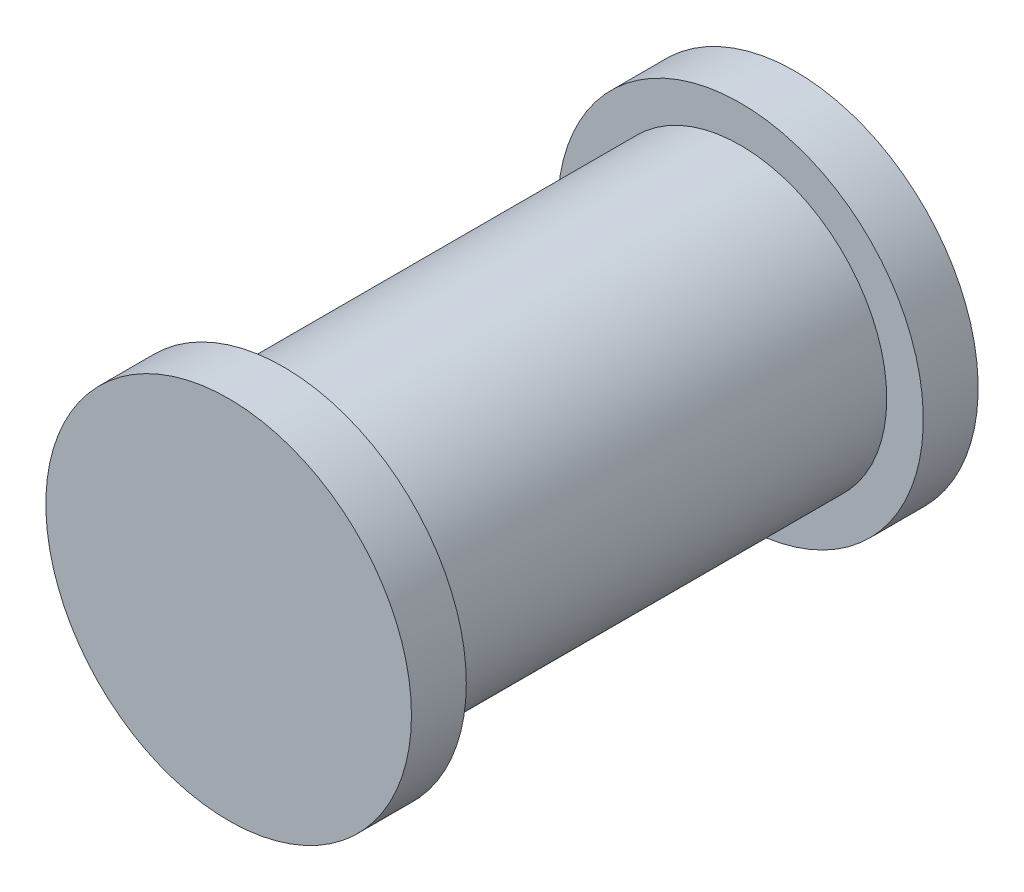
ISO-10303-21;
HEADER;
FILE_DESCRIPTION(('STEP AP214'),'2;1');
FILE_NAME('part.step','',(''),(''),'','','');
FILE_SCHEMA(('AUTOMOTIVE_DESIGN { 1 0 10303 214 1 1 1 1 }'));
ENDSEC;
DATA;
#1=APPLICATION_CONTEXT('core data for automotive mechanical design processes');
#2=APPLICATION_PROTOCOL_DEFINITION('international standard','automotive_design',2000,#1);
#3=PRODUCT_CONTEXT('',#1,'mechanical');
#4=PRODUCT('Part','Part','',(#3));
#5=PRODUCT_RELATED_PRODUCT_CATEGORY('part','',(#4));
#6=PRODUCT_DEFINITION_FORMATION('','',#4);
#7=PRODUCT_DEFINITION_CONTEXT('part definition',#1,'design');
#8=PRODUCT_DEFINITION('design','',#6,#7);
#9=PRODUCT_DEFINITION_SHAPE('','',#8);
#10=(LENGTH_UNIT() NAMED_UNIT(*) SI_UNIT(.MILLI.,.METRE.));
#11=(NAMED_UNIT(*) PLANE_ANGLE_UNIT() SI_UNIT($,.RADIAN.));
#12=(NAMED_UNIT(*) SI_UNIT($,.STERADIAN.) SOLID_ANGLE_UNIT());
#13=UNCERTAINTY_MEASURE_WITH_UNIT(LENGTH_MEASURE(1.E-05),#10,'distance_accuracy_value','');
#14=(GEOMETRIC_REPRESENTATION_CONTEXT(3) GLOBAL_UNCERTAINTY_ASSIGNED_CONTEXT((#13)) GLOBAL_UNIT_ASSIGNED_CONTEXT((#10,
#11,#12)) REPRESENTATION_CONTEXT('',''));
#15=CARTESIAN_POINT('',(0.,0.,0.));
#16=DIRECTION('',(0.,0.,1.));
#17=DIRECTION('',(1.,0.,0.));
#18=AXIS2_PLACEMENT_3D('',#15,#16,#17);
#19=CARTESIAN_POINT('',(0.,0.,25.));
#20=DIRECTION('',(0.,0.,-1.));
#21=DIRECTION('',(-1.,0.,0.));
#22=AXIS2_PLACEMENT_3D('',#19,#20,#21);
#23=CYLINDRICAL_SURFACE('',#22,8.);
#24=CARTESIAN_POINT('',(0.,0.,25.));
#25=DIRECTION('',(0.,0.,1.));
#26=DIRECTION('',(1.,0.,0.));
#27=AXIS2_PLACEMENT_3D('',#24,#25,#26);
#28=CIRCLE('',#27,8.);
#29=CARTESIAN_POINT('',(8.,0.,25.));
#30=VERTEX_POINT('',#29);
#31=EDGE_CURVE('E10',#30,#30,#28,.T.);
#32=ORIENTED_EDGE('',*,*,#31,.F.);
#33=EDGE_LOOP('',(#32));
#34=FACE_BOUND('',#33,.T.);
#35=CARTESIAN_POINT('',(0.,0.,0.));
#36=DIRECTION('',(0.,0.,1.));
#37=DIRECTION('',(1.,0.,0.));
#38=AXIS2_PLACEMENT_3D('',#35,#36,#37);
#39=CIRCLE('',#38,8.);
#40=CARTESIAN_POINT('',(8.,0.,0.));
#41=VERTEX_POINT('',#40);
#42=EDGE_CURVE('E39',#41,#41,#39,.T.);
#43=ORIENTED_EDGE('',*,*,#42,.T.);
#44=EDGE_LOOP('',(#43));
#45=FACE_BOUND('',#44,.T.);
#46=ADVANCED_FACE('F36',(#34,#45),#23,.T.);
#47=CARTESIAN_POINT('',(0.,0.,28.));
#48=DIRECTION('',(0.,0.,-1.));
#49=DIRECTION('',(-1.,0.,0.));
#50=AXIS2_PLACEMENT_3D('',#47,#48,#49);
#51=CYLINDRICAL_SURFACE('',#50,10.);
#52=CARTESIAN_POINT('',(0.,0.,28.));
#53=DIRECTION('',(0.,0.,1.));
#54=DIRECTION('',(1.,0.,0.));
#55=AXIS2_PLACEMENT_3D('',#52,#53,#54);
#56=CIRCLE('',#55,10.);
#57=CARTESIAN_POINT('',(10.,0.,28.));
#58=VERTEX_POINT('',#57);
#59=EDGE_CURVE('E43',#58,#58,#56,.T.);
#60=ORIENTED_EDGE('',*,*,#59,.F.);
#61=EDGE_LOOP('',(#60));
#62=FACE_BOUND('',#61,.T.);
#63=CARTESIAN_POINT('',(0.,0.,25.));
#64=DIRECTION('',(0.,0.,1.));
#65=DIRECTION('',(1.,0.,0.));
#66=AXIS2_PLACEMENT_3D('',#63,#64,#65);
#67=CIRCLE('',#66,10.);
#68=CARTESIAN_POINT('',(10.,0.,25.));
#69=VERTEX_POINT('',#68);
#70=EDGE_CURVE('E47',#69,#69,#67,.T.);
#71=ORIENTED_EDGE('',*,*,#70,.T.);
#72=EDGE_LOOP('',(#71));
#73=FACE_BOUND('',#72,.T.);
#74=ADVANCED_FACE('F84',(#62,#73),#51,.T.);
#75=CARTESIAN_POINT('',(0.,0.,28.));
#76=DIRECTION('',(0.,0.,1.));
#77=DIRECTION('',(1.,0.,0.));
#78=AXIS2_PLACEMENT_3D('',#75,#76,#77);
#79=PLANE('',#78);
#80=ORIENTED_EDGE('',*,*,#59,.T.);
#81=EDGE_LOOP('',(#80));
#82=FACE_BOUND('',#81,.T.);
#83=ADVANCED_FACE('F80',(#82),#79,.T.);
#84=CARTESIAN_POINT('',(0.,0.,25.));
#85=DIRECTION('',(0.,0.,1.));
#86=DIRECTION('',(1.,0.,0.));
#87=AXIS2_PLACEMENT_3D('',#84,#85,#86);
#88=PLANE('',#87);
#89=ORIENTED_EDGE('',*,*,#31,.T.);
#90=EDGE_LOOP('',(#89));
#91=FACE_BOUND('',#90,.T.);
#92=ORIENTED_EDGE('',*,*,#70,.F.);
#93=EDGE_LOOP('',(#92));
#94=FACE_BOUND('',#93,.T.);
#95=ADVANCED_FACE('F72',(#91,#94),#88,.F.);
#96=CARTESIAN_POINT('',(0.,0.,-3.));
#97=DIRECTION('',(0.,0.,1.));
#98=DIRECTION('',(1.,0.,0.));
#99=AXIS2_PLACEMENT_3D('',#96,#97,#98);
#100=CYLINDRICAL_SURFACE('',#99,10.);
#101=CARTESIAN_POINT('',(0.,0.,-3.));
#102=DIRECTION('',(0.,0.,-1.));
#103=DIRECTION('',(-1.,0.,0.));
#104=AXIS2_PLACEMENT_3D('',#101,#102,#103);
#105=CIRCLE('',#104,10.);
#106=CARTESIAN_POINT('',(-10.,0.,-3.));
#107=VERTEX_POINT('',#106);
#108=EDGE_CURVE('E55',#107,#107,#105,.T.);
#109=ORIENTED_EDGE('',*,*,#108,.F.);
#110=EDGE_LOOP('',(#109));
#111=FACE_BOUND('',#110,.T.);
#112=CARTESIAN_POINT('',(0.,0.,0.));
#113=DIRECTION('',(0.,0.,-1.));
#114=DIRECTION('',(-1.,0.,0.));
#115=AXIS2_PLACEMENT_3D('',#112,#113,#114);
#116=CIRCLE('',#115,10.);
#117=CARTESIAN_POINT('',(-10.,0.,0.));
#118=VERTEX_POINT('',#117);
#119=EDGE_CURVE('E52',#118,#118,#116,.T.);
#120=ORIENTED_EDGE('',*,*,#119,.T.);
#121=EDGE_LOOP('',(#120));
#122=FACE_BOUND('',#121,.T.);
#123=ADVANCED_FACE('F70',(#111,#122),#100,.T.);
#124=CARTESIAN_POINT('',(0.,0.,-3.));
#125=DIRECTION('',(0.,0.,-1.));
#126=DIRECTION('',(-1.,0.,0.));
#127=AXIS2_PLACEMENT_3D('',#124,#125,#126);
#128=PLANE('',#127);
#129=ORIENTED_EDGE('',*,*,#108,.T.);
#130=EDGE_LOOP('',(#129));
#131=FACE_BOUND('',#130,.T.);
#132=ADVANCED_FACE('F66',(#131),#128,.T.);
#133=CARTESIAN_POINT('',(0.,0.,0.));
#134=DIRECTION('',(0.,0.,-1.));
#135=DIRECTION('',(-1.,0.,0.));
#136=AXIS2_PLACEMENT_3D('',#133,#134,#135);
#137=PLANE('',#136);
#138=ORIENTED_EDGE('',*,*,#42,.F.);
#139=EDGE_LOOP('',(#138));
#140=FACE_BOUND('',#139,.T.);
#141=ORIENTED_EDGE('',*,*,#119,.F.);
#142=EDGE_LOOP('',(#141));
#143=FACE_BOUND('',#142,.T.);
#144=ADVANCED_FACE('F63',(#140,#143),#137,.F.);
#145=CLOSED_SHELL('',(#46,#74,#83,#95,#123,#132,#144));
#146=MANIFOLD_SOLID_BREP('B2',#145);
#147=ADVANCED_BREP_SHAPE_REPRESENTATION('',(#18,#146),#14);
#148=SHAPE_DEFINITION_REPRESENTATION(#9,#147);
ENDSEC;
END-ISO-10303-21;
